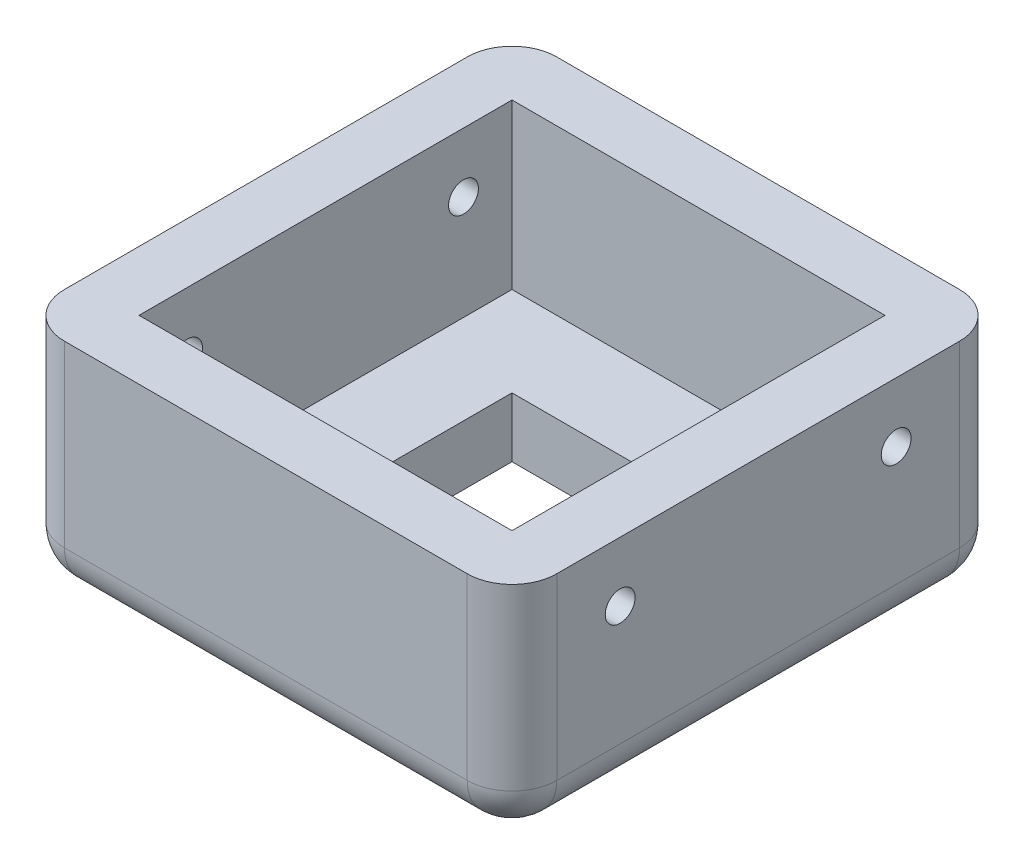
ISO-10303-21;
HEADER;
FILE_DESCRIPTION(('STEP AP214'),'2;1');
FILE_NAME('part.step','',(''),(''),'','','');
FILE_SCHEMA(('AUTOMOTIVE_DESIGN { 1 0 10303 214 1 1 1 1 }'));
ENDSEC;
DATA;
#1=APPLICATION_CONTEXT('core data for automotive mechanical design processes');
#2=APPLICATION_PROTOCOL_DEFINITION('international standard','automotive_design',2000,#1);
#3=PRODUCT_CONTEXT('',#1,'mechanical');
#4=PRODUCT('Part','Part','',(#3));
#5=PRODUCT_RELATED_PRODUCT_CATEGORY('part','',(#4));
#6=PRODUCT_DEFINITION_FORMATION('','',#4);
#7=PRODUCT_DEFINITION_CONTEXT('part definition',#1,'design');
#8=PRODUCT_DEFINITION('design','',#6,#7);
#9=PRODUCT_DEFINITION_SHAPE('','',#8);
#10=(LENGTH_UNIT() NAMED_UNIT(*) SI_UNIT(.MILLI.,.METRE.));
#11=(NAMED_UNIT(*) PLANE_ANGLE_UNIT() SI_UNIT($,.RADIAN.));
#12=(NAMED_UNIT(*) SI_UNIT($,.STERADIAN.) SOLID_ANGLE_UNIT());
#13=UNCERTAINTY_MEASURE_WITH_UNIT(LENGTH_MEASURE(1.E-05),#10,'distance_accuracy_value','');
#14=(GEOMETRIC_REPRESENTATION_CONTEXT(3) GLOBAL_UNCERTAINTY_ASSIGNED_CONTEXT((#13)) GLOBAL_UNIT_ASSIGNED_CONTEXT((#10,
#11,#12)) REPRESENTATION_CONTEXT('',''));
#15=CARTESIAN_POINT('',(0.,0.,0.));
#16=DIRECTION('',(0.,0.,1.));
#17=DIRECTION('',(1.,0.,0.));
#18=AXIS2_PLACEMENT_3D('',#15,#16,#17);
#19=CARTESIAN_POINT('',(0.,15.,0.));
#20=DIRECTION('',(1.,0.,0.));
#21=DIRECTION('',(0.,0.,-1.));
#22=AXIS2_PLACEMENT_3D('',#19,#20,#21);
#23=PLANE('',#22);
#24=DIRECTION('',(0.,-1.,0.));
#25=VECTOR('',#24,1.);
#26=CARTESIAN_POINT('',(0.,15.,-13.));
#27=LINE('',#26,#25);
#28=CARTESIAN_POINT('',(0.,4.,-13.));
#29=VERTEX_POINT('',#28);
#30=CARTESIAN_POINT('',(0.,0.,-13.));
#31=VERTEX_POINT('',#30);
#32=EDGE_CURVE('E229',#29,#31,#27,.T.);
#33=ORIENTED_EDGE('',*,*,#32,.F.);
#34=DIRECTION('',(0.,0.,1.));
#35=VECTOR('',#34,1.);
#36=CARTESIAN_POINT('',(0.,4.,0.));
#37=LINE('',#36,#35);
#38=CARTESIAN_POINT('',(0.,4.,0.));
#39=VERTEX_POINT('',#38);
#40=EDGE_CURVE('E214',#29,#39,#37,.T.);
#41=ORIENTED_EDGE('',*,*,#40,.T.);
#42=DIRECTION('',(0.,-1.,0.));
#43=VECTOR('',#42,1.);
#44=CARTESIAN_POINT('',(0.,15.,0.));
#45=LINE('',#44,#43);
#46=CARTESIAN_POINT('',(0.,0.,0.));
#47=VERTEX_POINT('',#46);
#48=EDGE_CURVE('E235',#39,#47,#45,.T.);
#49=ORIENTED_EDGE('',*,*,#48,.T.);
#50=DIRECTION('',(0.,0.,1.));
#51=VECTOR('',#50,1.);
#52=CARTESIAN_POINT('',(0.,0.,0.));
#53=LINE('',#52,#51);
#54=EDGE_CURVE('E217',#31,#47,#53,.T.);
#55=ORIENTED_EDGE('',*,*,#54,.F.);
#56=EDGE_LOOP('',(#33,#41,#49,#55));
#57=FACE_BOUND('',#56,.T.);
#58=ADVANCED_FACE('F37',(#57),#23,.T.);
#59=CARTESIAN_POINT('',(0.,15.,0.));
#60=DIRECTION('',(0.,0.,-1.));
#61=DIRECTION('',(-1.,0.,0.));
#62=AXIS2_PLACEMENT_3D('',#59,#60,#61);
#63=PLANE('',#62);
#64=ORIENTED_EDGE('',*,*,#48,.F.);
#65=DIRECTION('',(1.,0.,0.));
#66=VECTOR('',#65,1.);
#67=CARTESIAN_POINT('',(0.,4.,0.));
#68=LINE('',#67,#66);
#69=CARTESIAN_POINT('',(13.,4.,0.));
#70=VERTEX_POINT('',#69);
#71=EDGE_CURVE('E211',#39,#70,#68,.T.);
#72=ORIENTED_EDGE('',*,*,#71,.T.);
#73=DIRECTION('',(0.,-1.,0.));
#74=VECTOR('',#73,1.);
#75=CARTESIAN_POINT('',(13.,15.,0.));
#76=LINE('',#75,#74);
#77=CARTESIAN_POINT('',(13.,0.,0.));
#78=VERTEX_POINT('',#77);
#79=EDGE_CURVE('E233',#70,#78,#76,.T.);
#80=ORIENTED_EDGE('',*,*,#79,.T.);
#81=DIRECTION('',(1.,0.,0.));
#82=VECTOR('',#81,1.);
#83=CARTESIAN_POINT('',(0.,0.,0.));
#84=LINE('',#83,#82);
#85=EDGE_CURVE('E220',#47,#78,#84,.T.);
#86=ORIENTED_EDGE('',*,*,#85,.F.);
#87=EDGE_LOOP('',(#64,#72,#80,#86));
#88=FACE_BOUND('',#87,.T.);
#89=ADVANCED_FACE('F365',(#88),#63,.T.);
#90=CARTESIAN_POINT('',(13.,15.,0.));
#91=DIRECTION('',(-1.,0.,0.));
#92=DIRECTION('',(0.,0.,1.));
#93=AXIS2_PLACEMENT_3D('',#90,#91,#92);
#94=PLANE('',#93);
#95=ORIENTED_EDGE('',*,*,#79,.F.);
#96=DIRECTION('',(0.,0.,-1.));
#97=VECTOR('',#96,1.);
#98=CARTESIAN_POINT('',(13.,4.,0.));
#99=LINE('',#98,#97);
#100=CARTESIAN_POINT('',(13.,4.,-13.));
#101=VERTEX_POINT('',#100);
#102=EDGE_CURVE('E205',#70,#101,#99,.T.);
#103=ORIENTED_EDGE('',*,*,#102,.T.);
#104=DIRECTION('',(0.,-1.,0.));
#105=VECTOR('',#104,1.);
#106=CARTESIAN_POINT('',(13.,15.,-13.));
#107=LINE('',#106,#105);
#108=CARTESIAN_POINT('',(13.,0.,-13.));
#109=VERTEX_POINT('',#108);
#110=EDGE_CURVE('E231',#101,#109,#107,.T.);
#111=ORIENTED_EDGE('',*,*,#110,.T.);
#112=DIRECTION('',(0.,0.,-1.));
#113=VECTOR('',#112,1.);
#114=CARTESIAN_POINT('',(13.,0.,0.));
#115=LINE('',#114,#113);
#116=EDGE_CURVE('E223',#78,#109,#115,.T.);
#117=ORIENTED_EDGE('',*,*,#116,.F.);
#118=EDGE_LOOP('',(#95,#103,#111,#117));
#119=FACE_BOUND('',#118,.T.);
#120=ADVANCED_FACE('F371',(#119),#94,.T.);
#121=CARTESIAN_POINT('',(0.,15.,-13.));
#122=DIRECTION('',(0.,0.,1.));
#123=DIRECTION('',(1.,0.,0.));
#124=AXIS2_PLACEMENT_3D('',#121,#122,#123);
#125=PLANE('',#124);
#126=ORIENTED_EDGE('',*,*,#110,.F.);
#127=DIRECTION('',(-1.,0.,0.));
#128=VECTOR('',#127,1.);
#129=CARTESIAN_POINT('',(0.,4.,-13.));
#130=LINE('',#129,#128);
#131=EDGE_CURVE('E249',#101,#29,#130,.T.);
#132=ORIENTED_EDGE('',*,*,#131,.T.);
#133=ORIENTED_EDGE('',*,*,#32,.T.);
#134=DIRECTION('',(-1.,0.,0.));
#135=VECTOR('',#134,1.);
#136=CARTESIAN_POINT('',(0.,0.,-13.));
#137=LINE('',#136,#135);
#138=EDGE_CURVE('E226',#109,#31,#137,.T.);
#139=ORIENTED_EDGE('',*,*,#138,.F.);
#140=EDGE_LOOP('',(#126,#132,#133,#139));
#141=FACE_BOUND('',#140,.T.);
#142=ADVANCED_FACE('F381',(#141),#125,.T.);
#143=CARTESIAN_POINT('',(0.,15.,0.));
#144=DIRECTION('',(0.,1.,0.));
#145=DIRECTION('',(0.,0.,1.));
#146=AXIS2_PLACEMENT_3D('',#143,#144,#145);
#147=PLANE('',#146);
#148=DIRECTION('',(0.,0.,1.));
#149=VECTOR('',#148,1.);
#150=CARTESIAN_POINT('',(-6.00000000000001,15.,-19.));
#151=LINE('',#150,#149);
#152=CARTESIAN_POINT('',(-6.00000000000001,15.,-19.));
#153=VERTEX_POINT('',#152);
#154=CARTESIAN_POINT('',(-6.,15.,6.00000000000001));
#155=VERTEX_POINT('',#154);
#156=EDGE_CURVE('E169',#153,#155,#151,.T.);
#157=ORIENTED_EDGE('',*,*,#156,.F.);
#158=DIRECTION('',(-1.,0.,0.));
#159=VECTOR('',#158,1.);
#160=CARTESIAN_POINT('',(-6.00000000000001,15.,-19.));
#161=LINE('',#160,#159);
#162=CARTESIAN_POINT('',(19.,15.,-19.));
#163=VERTEX_POINT('',#162);
#164=EDGE_CURVE('E186',#163,#153,#161,.T.);
#165=ORIENTED_EDGE('',*,*,#164,.F.);
#166=DIRECTION('',(0.,0.,-1.));
#167=VECTOR('',#166,1.);
#168=CARTESIAN_POINT('',(19.,15.,-19.));
#169=LINE('',#168,#167);
#170=CARTESIAN_POINT('',(19.,15.,6.));
#171=VERTEX_POINT('',#170);
#172=EDGE_CURVE('E189',#171,#163,#169,.T.);
#173=ORIENTED_EDGE('',*,*,#172,.F.);
#174=DIRECTION('',(1.,0.,0.));
#175=VECTOR('',#174,1.);
#176=CARTESIAN_POINT('',(-6.,15.,6.00000000000001));
#177=LINE('',#176,#175);
#178=EDGE_CURVE('E198',#155,#171,#177,.T.);
#179=ORIENTED_EDGE('',*,*,#178,.F.);
#180=EDGE_LOOP('',(#157,#165,#173,#179));
#181=FACE_BOUND('',#180,.T.);
#182=DIRECTION('',(-1.,0.,0.));
#183=VECTOR('',#182,1.);
#184=CARTESIAN_POINT('',(-10.,15.,-23.));
#185=LINE('',#184,#183);
#186=CARTESIAN_POINT('',(20.,15.,-23.));
#187=VERTEX_POINT('',#186);
#188=CARTESIAN_POINT('',(-7.00000000000001,15.,-23.));
#189=VERTEX_POINT('',#188);
#190=EDGE_CURVE('E246',#187,#189,#185,.T.);
#191=ORIENTED_EDGE('',*,*,#190,.T.);
#192=CARTESIAN_POINT('',(-7.,15.,-20.));
#193=DIRECTION('',(0.,1.,0.));
#194=DIRECTION('',(0.,0.,1.));
#195=AXIS2_PLACEMENT_3D('',#192,#193,#194);
#196=CIRCLE('',#195,3.);
#197=CARTESIAN_POINT('',(-10.,15.,-20.));
#198=VERTEX_POINT('',#197);
#199=EDGE_CURVE('E271',#189,#198,#196,.T.);
#200=ORIENTED_EDGE('',*,*,#199,.T.);
#201=DIRECTION('',(0.,0.,1.));
#202=VECTOR('',#201,1.);
#203=CARTESIAN_POINT('',(-10.,15.,-23.));
#204=LINE('',#203,#202);
#205=CARTESIAN_POINT('',(-9.99999999999998,15.,7.00000000000003));
#206=VERTEX_POINT('',#205);
#207=EDGE_CURVE('E237',#198,#206,#204,.T.);
#208=ORIENTED_EDGE('',*,*,#207,.T.);
#209=CARTESIAN_POINT('',(-6.99999999999998,15.,7.00000000000002));
#210=DIRECTION('',(0.,1.,0.));
#211=DIRECTION('',(0.,0.,1.));
#212=AXIS2_PLACEMENT_3D('',#209,#210,#211);
#213=CIRCLE('',#212,3.);
#214=CARTESIAN_POINT('',(-6.99999999999998,15.,10.));
#215=VERTEX_POINT('',#214);
#216=EDGE_CURVE('E269',#206,#215,#213,.T.);
#217=ORIENTED_EDGE('',*,*,#216,.T.);
#218=DIRECTION('',(1.,0.,0.));
#219=VECTOR('',#218,1.);
#220=CARTESIAN_POINT('',(-9.99999999999998,15.,10.));
#221=LINE('',#220,#219);
#222=CARTESIAN_POINT('',(20.,15.,10.));
#223=VERTEX_POINT('',#222);
#224=EDGE_CURVE('E240',#215,#223,#221,.T.);
#225=ORIENTED_EDGE('',*,*,#224,.T.);
#226=CARTESIAN_POINT('',(20.,15.,7.));
#227=DIRECTION('',(0.,1.,0.));
#228=DIRECTION('',(0.,0.,1.));
#229=AXIS2_PLACEMENT_3D('',#226,#227,#228);
#230=CIRCLE('',#229,3.);
#231=CARTESIAN_POINT('',(23.,15.,7.));
#232=VERTEX_POINT('',#231);
#233=EDGE_CURVE('E265',#223,#232,#230,.T.);
#234=ORIENTED_EDGE('',*,*,#233,.T.);
#235=DIRECTION('',(0.,0.,-1.));
#236=VECTOR('',#235,1.);
#237=CARTESIAN_POINT('',(23.,15.,-23.));
#238=LINE('',#237,#236);
#239=CARTESIAN_POINT('',(23.,15.,-20.));
#240=VERTEX_POINT('',#239);
#241=EDGE_CURVE('E243',#232,#240,#238,.T.);
#242=ORIENTED_EDGE('',*,*,#241,.T.);
#243=CARTESIAN_POINT('',(20.,15.,-20.));
#244=DIRECTION('',(0.,1.,0.));
#245=DIRECTION('',(0.,0.,1.));
#246=AXIS2_PLACEMENT_3D('',#243,#244,#245);
#247=CIRCLE('',#246,3.);
#248=EDGE_CURVE('E267',#240,#187,#247,.T.);
#249=ORIENTED_EDGE('',*,*,#248,.T.);
#250=EDGE_LOOP('',(#191,#200,#208,#217,#225,#234,#242,#249));
#251=FACE_BOUND('',#250,.T.);
#252=ADVANCED_FACE('F377',(#181,#251),#147,.T.);
#253=CARTESIAN_POINT('',(0.,0.,0.));
#254=DIRECTION('',(0.,1.,0.));
#255=DIRECTION('',(0.,0.,1.));
#256=AXIS2_PLACEMENT_3D('',#253,#254,#255);
#257=PLANE('',#256);
#258=DIRECTION('',(1.,0.,0.));
#259=VECTOR('',#258,1.);
#260=CARTESIAN_POINT('',(0.,0.,7.00000000000002));
#261=LINE('',#260,#259);
#262=CARTESIAN_POINT('',(20.,0.,7.));
#263=VERTEX_POINT('',#262);
#264=CARTESIAN_POINT('',(-6.99999999999998,0.,7.00000000000002));
#265=VERTEX_POINT('',#264);
#266=EDGE_CURVE('E279',#263,#265,#261,.F.);
#267=ORIENTED_EDGE('',*,*,#266,.T.);
#268=DIRECTION('',(0.,0.,1.));
#269=VECTOR('',#268,1.);
#270=CARTESIAN_POINT('',(-6.99999999999999,0.,0.));
#271=LINE('',#270,#269);
#272=CARTESIAN_POINT('',(-7.,0.,-20.));
#273=VERTEX_POINT('',#272);
#274=EDGE_CURVE('E285',#265,#273,#271,.F.);
#275=ORIENTED_EDGE('',*,*,#274,.T.);
#276=DIRECTION('',(-1.,0.,0.));
#277=VECTOR('',#276,1.);
#278=CARTESIAN_POINT('',(0.,0.,-20.));
#279=LINE('',#278,#277);
#280=CARTESIAN_POINT('',(20.,0.,-20.));
#281=VERTEX_POINT('',#280);
#282=EDGE_CURVE('E283',#273,#281,#279,.F.);
#283=ORIENTED_EDGE('',*,*,#282,.T.);
#284=DIRECTION('',(0.,0.,-1.));
#285=VECTOR('',#284,1.);
#286=CARTESIAN_POINT('',(20.,0.,0.));
#287=LINE('',#286,#285);
#288=EDGE_CURVE('E281',#281,#263,#287,.F.);
#289=ORIENTED_EDGE('',*,*,#288,.T.);
#290=EDGE_LOOP('',(#267,#275,#283,#289));
#291=FACE_BOUND('',#290,.T.);
#292=ORIENTED_EDGE('',*,*,#54,.T.);
#293=ORIENTED_EDGE('',*,*,#85,.T.);
#294=ORIENTED_EDGE('',*,*,#116,.T.);
#295=ORIENTED_EDGE('',*,*,#138,.T.);
#296=EDGE_LOOP('',(#292,#293,#294,#295));
#297=FACE_BOUND('',#296,.T.);
#298=ADVANCED_FACE('F380',(#291,#297),#257,.F.);
#299=CARTESIAN_POINT('',(-10.,15.,-23.));
#300=DIRECTION('',(1.,0.,0.));
#301=DIRECTION('',(0.,0.,-1.));
#302=AXIS2_PLACEMENT_3D('',#299,#300,#301);
#303=PLANE('',#302);
#304=CARTESIAN_POINT('',(-9.99999999999999,11.,-15.75));
#305=DIRECTION('',(-1.,0.,0.));
#306=DIRECTION('',(0.,0.,1.));
#307=AXIS2_PLACEMENT_3D('',#304,#305,#306);
#308=CIRCLE('',#307,1.);
#309=CARTESIAN_POINT('',(-9.99999999999999,11.,-14.75));
#310=VERTEX_POINT('',#309);
#311=EDGE_CURVE('E338',#310,#310,#308,.T.);
#312=ORIENTED_EDGE('',*,*,#311,.F.);
#313=EDGE_LOOP('',(#312));
#314=FACE_BOUND('',#313,.T.);
#315=CARTESIAN_POINT('',(-9.99999999999999,11.,2.75));
#316=DIRECTION('',(-1.,0.,0.));
#317=DIRECTION('',(0.,0.,1.));
#318=AXIS2_PLACEMENT_3D('',#315,#316,#317);
#319=CIRCLE('',#318,1.);
#320=CARTESIAN_POINT('',(-9.99999999999999,11.,3.75000000000001));
#321=VERTEX_POINT('',#320);
#322=EDGE_CURVE('E329',#321,#321,#319,.T.);
#323=ORIENTED_EDGE('',*,*,#322,.F.);
#324=EDGE_LOOP('',(#323));
#325=FACE_BOUND('',#324,.T.);
#326=ORIENTED_EDGE('',*,*,#207,.F.);
#327=DIRECTION('',(0.,-1.,0.));
#328=VECTOR('',#327,1.);
#329=CARTESIAN_POINT('',(-10.,15.,-20.));
#330=LINE('',#329,#328);
#331=CARTESIAN_POINT('',(-10.,3.,-20.));
#332=VERTEX_POINT('',#331);
#333=EDGE_CURVE('E256',#198,#332,#330,.T.);
#334=ORIENTED_EDGE('',*,*,#333,.T.);
#335=DIRECTION('',(0.,0.,1.));
#336=VECTOR('',#335,1.);
#337=CARTESIAN_POINT('',(-10.,3.,-23.));
#338=LINE('',#337,#336);
#339=CARTESIAN_POINT('',(-9.99999999999998,3.,7.00000000000003));
#340=VERTEX_POINT('',#339);
#341=EDGE_CURVE('E252',#332,#340,#338,.T.);
#342=ORIENTED_EDGE('',*,*,#341,.T.);
#343=DIRECTION('',(0.,-1.,0.));
#344=VECTOR('',#343,1.);
#345=CARTESIAN_POINT('',(-9.99999999999998,15.,7.00000000000003));
#346=LINE('',#345,#344);
#347=EDGE_CURVE('E254',#340,#206,#346,.F.);
#348=ORIENTED_EDGE('',*,*,#347,.T.);
#349=EDGE_LOOP('',(#326,#334,#342,#348));
#350=FACE_BOUND('',#349,.T.);
#351=ADVANCED_FACE('F385',(#314,#325,#350),#303,.F.);
#352=CARTESIAN_POINT('',(-9.99999999999998,15.,10.));
#353=DIRECTION('',(0.,0.,-1.));
#354=DIRECTION('',(-1.,0.,0.));
#355=AXIS2_PLACEMENT_3D('',#352,#353,#354);
#356=PLANE('',#355);
#357=ORIENTED_EDGE('',*,*,#224,.F.);
#358=DIRECTION('',(0.,-1.,0.));
#359=VECTOR('',#358,1.);
#360=CARTESIAN_POINT('',(-6.99999999999998,15.,10.));
#361=LINE('',#360,#359);
#362=CARTESIAN_POINT('',(-6.99999999999998,3.,10.));
#363=VERTEX_POINT('',#362);
#364=EDGE_CURVE('E277',#215,#363,#361,.T.);
#365=ORIENTED_EDGE('',*,*,#364,.T.);
#366=DIRECTION('',(1.,0.,0.));
#367=VECTOR('',#366,1.);
#368=CARTESIAN_POINT('',(-9.99999999999998,3.,10.));
#369=LINE('',#368,#367);
#370=CARTESIAN_POINT('',(20.,3.,10.));
#371=VERTEX_POINT('',#370);
#372=EDGE_CURVE('E273',#363,#371,#369,.T.);
#373=ORIENTED_EDGE('',*,*,#372,.T.);
#374=DIRECTION('',(0.,-1.,0.));
#375=VECTOR('',#374,1.);
#376=CARTESIAN_POINT('',(20.,15.,10.));
#377=LINE('',#376,#375);
#378=EDGE_CURVE('E275',#371,#223,#377,.F.);
#379=ORIENTED_EDGE('',*,*,#378,.T.);
#380=EDGE_LOOP('',(#357,#365,#373,#379));
#381=FACE_BOUND('',#380,.T.);
#382=ADVANCED_FACE('F394',(#381),#356,.F.);
#383=CARTESIAN_POINT('',(23.,15.,-23.));
#384=DIRECTION('',(-1.,0.,0.));
#385=DIRECTION('',(0.,0.,1.));
#386=AXIS2_PLACEMENT_3D('',#383,#384,#385);
#387=PLANE('',#386);
#388=CARTESIAN_POINT('',(23.,11.,-15.75));
#389=DIRECTION('',(-1.,0.,0.));
#390=DIRECTION('',(0.,0.,1.));
#391=AXIS2_PLACEMENT_3D('',#388,#389,#390);
#392=CIRCLE('',#391,1.);
#393=CARTESIAN_POINT('',(23.,11.,-14.75));
#394=VERTEX_POINT('',#393);
#395=EDGE_CURVE('E341',#394,#394,#392,.T.);
#396=ORIENTED_EDGE('',*,*,#395,.T.);
#397=EDGE_LOOP('',(#396));
#398=FACE_BOUND('',#397,.T.);
#399=CARTESIAN_POINT('',(23.,11.,2.75));
#400=DIRECTION('',(-1.,0.,0.));
#401=DIRECTION('',(0.,0.,1.));
#402=AXIS2_PLACEMENT_3D('',#399,#400,#401);
#403=CIRCLE('',#402,1.);
#404=CARTESIAN_POINT('',(23.,11.,3.75));
#405=VERTEX_POINT('',#404);
#406=EDGE_CURVE('E324',#405,#405,#403,.T.);
#407=ORIENTED_EDGE('',*,*,#406,.T.);
#408=EDGE_LOOP('',(#407));
#409=FACE_BOUND('',#408,.T.);
#410=DIRECTION('',(0.,0.,-1.));
#411=VECTOR('',#410,1.);
#412=CARTESIAN_POINT('',(23.,3.,-23.));
#413=LINE('',#412,#411);
#414=CARTESIAN_POINT('',(23.,3.,7.));
#415=VERTEX_POINT('',#414);
#416=CARTESIAN_POINT('',(23.,3.,-20.));
#417=VERTEX_POINT('',#416);
#418=EDGE_CURVE('E46',#415,#417,#413,.T.);
#419=ORIENTED_EDGE('',*,*,#418,.T.);
#420=DIRECTION('',(0.,-1.,0.));
#421=VECTOR('',#420,1.);
#422=CARTESIAN_POINT('',(23.,15.,-20.));
#423=LINE('',#422,#421);
#424=EDGE_CURVE('E11',#417,#240,#423,.F.);
#425=ORIENTED_EDGE('',*,*,#424,.T.);
#426=ORIENTED_EDGE('',*,*,#241,.F.);
#427=DIRECTION('',(0.,-1.,0.));
#428=VECTOR('',#427,1.);
#429=CARTESIAN_POINT('',(23.,15.,7.));
#430=LINE('',#429,#428);
#431=EDGE_CURVE('E57',#232,#415,#430,.T.);
#432=ORIENTED_EDGE('',*,*,#431,.T.);
#433=EDGE_LOOP('',(#419,#425,#426,#432));
#434=FACE_BOUND('',#433,.T.);
#435=ADVANCED_FACE('F390',(#398,#409,#434),#387,.F.);
#436=CARTESIAN_POINT('',(-10.,15.,-23.));
#437=DIRECTION('',(0.,0.,1.));
#438=DIRECTION('',(1.,0.,0.));
#439=AXIS2_PLACEMENT_3D('',#436,#437,#438);
#440=PLANE('',#439);
#441=DIRECTION('',(-1.,0.,0.));
#442=VECTOR('',#441,1.);
#443=CARTESIAN_POINT('',(-10.,3.,-23.));
#444=LINE('',#443,#442);
#445=CARTESIAN_POINT('',(20.,3.,-23.));
#446=VERTEX_POINT('',#445);
#447=CARTESIAN_POINT('',(-7.00000000000001,3.,-23.));
#448=VERTEX_POINT('',#447);
#449=EDGE_CURVE('E261',#446,#448,#444,.T.);
#450=ORIENTED_EDGE('',*,*,#449,.T.);
#451=DIRECTION('',(0.,-1.,0.));
#452=VECTOR('',#451,1.);
#453=CARTESIAN_POINT('',(-7.00000000000001,15.,-23.));
#454=LINE('',#453,#452);
#455=EDGE_CURVE('E263',#448,#189,#454,.F.);
#456=ORIENTED_EDGE('',*,*,#455,.T.);
#457=ORIENTED_EDGE('',*,*,#190,.F.);
#458=DIRECTION('',(0.,-1.,0.));
#459=VECTOR('',#458,1.);
#460=CARTESIAN_POINT('',(20.,15.,-23.));
#461=LINE('',#460,#459);
#462=EDGE_CURVE('E259',#187,#446,#461,.T.);
#463=ORIENTED_EDGE('',*,*,#462,.T.);
#464=EDGE_LOOP('',(#450,#456,#457,#463));
#465=FACE_BOUND('',#464,.T.);
#466=ADVANCED_FACE('F387',(#465),#440,.F.);
#467=CARTESIAN_POINT('',(-6.00000000000001,4.,-19.));
#468=DIRECTION('',(-1.,0.,0.));
#469=DIRECTION('',(0.,0.,1.));
#470=AXIS2_PLACEMENT_3D('',#467,#468,#469);
#471=PLANE('',#470);
#472=CARTESIAN_POINT('',(-6.00000000000001,11.,-15.75));
#473=DIRECTION('',(-1.,0.,0.));
#474=DIRECTION('',(0.,0.,1.));
#475=AXIS2_PLACEMENT_3D('',#472,#473,#474);
#476=CIRCLE('',#475,1.);
#477=CARTESIAN_POINT('',(-6.00000000000001,11.,-14.75));
#478=VERTEX_POINT('',#477);
#479=EDGE_CURVE('E334',#478,#478,#476,.T.);
#480=ORIENTED_EDGE('',*,*,#479,.T.);
#481=EDGE_LOOP('',(#480));
#482=FACE_BOUND('',#481,.T.);
#483=CARTESIAN_POINT('',(-6.,11.,2.75));
#484=DIRECTION('',(-1.,0.,0.));
#485=DIRECTION('',(0.,0.,1.));
#486=AXIS2_PLACEMENT_3D('',#483,#484,#485);
#487=CIRCLE('',#486,1.);
#488=CARTESIAN_POINT('',(-6.,11.,3.75));
#489=VERTEX_POINT('',#488);
#490=EDGE_CURVE('E192',#489,#489,#487,.T.);
#491=ORIENTED_EDGE('',*,*,#490,.T.);
#492=EDGE_LOOP('',(#491));
#493=FACE_BOUND('',#492,.T.);
#494=ORIENTED_EDGE('',*,*,#156,.T.);
#495=DIRECTION('',(0.,1.,0.));
#496=VECTOR('',#495,1.);
#497=CARTESIAN_POINT('',(-6.,4.,6.00000000000001));
#498=LINE('',#497,#496);
#499=CARTESIAN_POINT('',(-6.,4.,6.00000000000001));
#500=VERTEX_POINT('',#499);
#501=EDGE_CURVE('E162',#500,#155,#498,.T.);
#502=ORIENTED_EDGE('',*,*,#501,.F.);
#503=DIRECTION('',(0.,0.,1.));
#504=VECTOR('',#503,1.);
#505=CARTESIAN_POINT('',(-6.00000000000001,4.,-19.));
#506=LINE('',#505,#504);
#507=CARTESIAN_POINT('',(-6.00000000000001,4.,-19.));
#508=VERTEX_POINT('',#507);
#509=EDGE_CURVE('E166',#508,#500,#506,.T.);
#510=ORIENTED_EDGE('',*,*,#509,.F.);
#511=DIRECTION('',(0.,1.,0.));
#512=VECTOR('',#511,1.);
#513=CARTESIAN_POINT('',(-6.00000000000001,4.,-19.));
#514=LINE('',#513,#512);
#515=EDGE_CURVE('E203',#508,#153,#514,.T.);
#516=ORIENTED_EDGE('',*,*,#515,.T.);
#517=EDGE_LOOP('',(#494,#502,#510,#516));
#518=FACE_BOUND('',#517,.T.);
#519=ADVANCED_FACE('F164',(#482,#493,#518),#471,.F.);
#520=CARTESIAN_POINT('',(-6.00000000000001,4.,-19.));
#521=DIRECTION('',(0.,0.,-1.));
#522=DIRECTION('',(-1.,0.,0.));
#523=AXIS2_PLACEMENT_3D('',#520,#521,#522);
#524=PLANE('',#523);
#525=ORIENTED_EDGE('',*,*,#164,.T.);
#526=ORIENTED_EDGE('',*,*,#515,.F.);
#527=DIRECTION('',(-1.,0.,0.));
#528=VECTOR('',#527,1.);
#529=CARTESIAN_POINT('',(-6.00000000000001,4.,-19.));
#530=LINE('',#529,#528);
#531=CARTESIAN_POINT('',(19.,4.,-19.));
#532=VERTEX_POINT('',#531);
#533=EDGE_CURVE('E174',#532,#508,#530,.T.);
#534=ORIENTED_EDGE('',*,*,#533,.F.);
#535=DIRECTION('',(0.,1.,0.));
#536=VECTOR('',#535,1.);
#537=CARTESIAN_POINT('',(19.,4.,-19.));
#538=LINE('',#537,#536);
#539=EDGE_CURVE('E206',#532,#163,#538,.T.);
#540=ORIENTED_EDGE('',*,*,#539,.T.);
#541=EDGE_LOOP('',(#525,#526,#534,#540));
#542=FACE_BOUND('',#541,.T.);
#543=ADVANCED_FACE('F498',(#542),#524,.F.);
#544=CARTESIAN_POINT('',(19.,4.,-19.));
#545=DIRECTION('',(1.,0.,0.));
#546=DIRECTION('',(0.,0.,-1.));
#547=AXIS2_PLACEMENT_3D('',#544,#545,#546);
#548=PLANE('',#547);
#549=CARTESIAN_POINT('',(19.,11.,-15.75));
#550=DIRECTION('',(1.,0.,0.));
#551=DIRECTION('',(0.,0.,-1.));
#552=AXIS2_PLACEMENT_3D('',#549,#550,#551);
#553=CIRCLE('',#552,1.);
#554=CARTESIAN_POINT('',(19.,11.,-16.75));
#555=VERTEX_POINT('',#554);
#556=EDGE_CURVE('E41',#555,#555,#553,.T.);
#557=ORIENTED_EDGE('',*,*,#556,.T.);
#558=EDGE_LOOP('',(#557));
#559=FACE_BOUND('',#558,.T.);
#560=CARTESIAN_POINT('',(19.,11.,2.75));
#561=DIRECTION('',(1.,0.,0.));
#562=DIRECTION('',(0.,0.,-1.));
#563=AXIS2_PLACEMENT_3D('',#560,#561,#562);
#564=CIRCLE('',#563,1.);
#565=CARTESIAN_POINT('',(19.,11.,1.75));
#566=VERTEX_POINT('',#565);
#567=EDGE_CURVE('E322',#566,#566,#564,.T.);
#568=ORIENTED_EDGE('',*,*,#567,.T.);
#569=EDGE_LOOP('',(#568));
#570=FACE_BOUND('',#569,.T.);
#571=ORIENTED_EDGE('',*,*,#172,.T.);
#572=ORIENTED_EDGE('',*,*,#539,.F.);
#573=DIRECTION('',(0.,0.,-1.));
#574=VECTOR('',#573,1.);
#575=CARTESIAN_POINT('',(19.,4.,-19.));
#576=LINE('',#575,#574);
#577=CARTESIAN_POINT('',(19.,4.,6.));
#578=VERTEX_POINT('',#577);
#579=EDGE_CURVE('E182',#578,#532,#576,.T.);
#580=ORIENTED_EDGE('',*,*,#579,.F.);
#581=DIRECTION('',(0.,1.,0.));
#582=VECTOR('',#581,1.);
#583=CARTESIAN_POINT('',(19.,4.,6.));
#584=LINE('',#583,#582);
#585=EDGE_CURVE('E173',#578,#171,#584,.T.);
#586=ORIENTED_EDGE('',*,*,#585,.T.);
#587=EDGE_LOOP('',(#571,#572,#580,#586));
#588=FACE_BOUND('',#587,.T.);
#589=ADVANCED_FACE('F348',(#559,#570,#588),#548,.F.);
#590=CARTESIAN_POINT('',(-6.,4.,6.00000000000001));
#591=DIRECTION('',(0.,0.,1.));
#592=DIRECTION('',(1.,0.,0.));
#593=AXIS2_PLACEMENT_3D('',#590,#591,#592);
#594=PLANE('',#593);
#595=ORIENTED_EDGE('',*,*,#178,.T.);
#596=ORIENTED_EDGE('',*,*,#585,.F.);
#597=DIRECTION('',(1.,0.,0.));
#598=VECTOR('',#597,1.);
#599=CARTESIAN_POINT('',(-6.,4.,6.00000000000001));
#600=LINE('',#599,#598);
#601=EDGE_CURVE('E177',#500,#578,#600,.T.);
#602=ORIENTED_EDGE('',*,*,#601,.F.);
#603=ORIENTED_EDGE('',*,*,#501,.T.);
#604=EDGE_LOOP('',(#595,#596,#602,#603));
#605=FACE_BOUND('',#604,.T.);
#606=ADVANCED_FACE('F178',(#605),#594,.F.);
#607=CARTESIAN_POINT('',(0.,4.,0.));
#608=DIRECTION('',(0.,1.,0.));
#609=DIRECTION('',(0.,0.,1.));
#610=AXIS2_PLACEMENT_3D('',#607,#608,#609);
#611=PLANE('',#610);
#612=ORIENTED_EDGE('',*,*,#131,.F.);
#613=ORIENTED_EDGE('',*,*,#102,.F.);
#614=ORIENTED_EDGE('',*,*,#71,.F.);
#615=ORIENTED_EDGE('',*,*,#40,.F.);
#616=EDGE_LOOP('',(#612,#613,#614,#615));
#617=FACE_BOUND('',#616,.T.);
#618=ORIENTED_EDGE('',*,*,#509,.T.);
#619=ORIENTED_EDGE('',*,*,#601,.T.);
#620=ORIENTED_EDGE('',*,*,#579,.T.);
#621=ORIENTED_EDGE('',*,*,#533,.T.);
#622=EDGE_LOOP('',(#618,#619,#620,#621));
#623=FACE_BOUND('',#622,.T.);
#624=ADVANCED_FACE('F184',(#617,#623),#611,.T.);
#625=CARTESIAN_POINT('',(20.,15.,7.));
#626=DIRECTION('',(0.,-1.,0.));
#627=DIRECTION('',(0.,0.,-1.));
#628=AXIS2_PLACEMENT_3D('',#625,#626,#627);
#629=CYLINDRICAL_SURFACE('',#628,3.);
#630=CARTESIAN_POINT('',(20.,3.,7.));
#631=DIRECTION('',(0.,-1.,0.));
#632=DIRECTION('',(0.,0.,-1.));
#633=AXIS2_PLACEMENT_3D('',#630,#631,#632);
#634=CIRCLE('',#633,3.);
#635=EDGE_CURVE('E199',#415,#371,#634,.T.);
#636=ORIENTED_EDGE('',*,*,#635,.F.);
#637=ORIENTED_EDGE('',*,*,#431,.F.);
#638=ORIENTED_EDGE('',*,*,#233,.F.);
#639=ORIENTED_EDGE('',*,*,#378,.F.);
#640=EDGE_LOOP('',(#636,#637,#638,#639));
#641=FACE_BOUND('',#640,.T.);
#642=ADVANCED_FACE('F39',(#641),#629,.T.);
#643=CARTESIAN_POINT('',(20.,3.,7.));
#644=DIRECTION('',(0.,0.,1.));
#645=DIRECTION('',(1.,0.,0.));
#646=AXIS2_PLACEMENT_3D('',#643,#644,#645);
#647=SPHERICAL_SURFACE('',#646,3.);
#648=CARTESIAN_POINT('',(20.,3.,7.));
#649=DIRECTION('',(0.,0.,1.));
#650=DIRECTION('',(1.,0.,0.));
#651=AXIS2_PLACEMENT_3D('',#648,#649,#650);
#652=CIRCLE('',#651,3.);
#653=EDGE_CURVE('E315',#415,#263,#652,.F.);
#654=ORIENTED_EDGE('',*,*,#653,.F.);
#655=ORIENTED_EDGE('',*,*,#635,.T.);
#656=CARTESIAN_POINT('',(20.,3.,7.));
#657=DIRECTION('',(1.,0.,0.));
#658=DIRECTION('',(0.,0.,-1.));
#659=AXIS2_PLACEMENT_3D('',#656,#657,#658);
#660=CIRCLE('',#659,3.);
#661=EDGE_CURVE('E318',#263,#371,#660,.F.);
#662=ORIENTED_EDGE('',*,*,#661,.F.);
#663=EDGE_LOOP('',(#654,#655,#662));
#664=FACE_BOUND('',#663,.T.);
#665=ADVANCED_FACE('F439',(#664),#647,.T.);
#666=CARTESIAN_POINT('',(-6.99999999999998,15.,7.00000000000002));
#667=DIRECTION('',(0.,-1.,0.));
#668=DIRECTION('',(0.,0.,-1.));
#669=AXIS2_PLACEMENT_3D('',#666,#667,#668);
#670=CYLINDRICAL_SURFACE('',#669,3.);
#671=ORIENTED_EDGE('',*,*,#216,.F.);
#672=ORIENTED_EDGE('',*,*,#347,.F.);
#673=CARTESIAN_POINT('',(-6.99999999999998,3.,7.00000000000002));
#674=DIRECTION('',(0.,-1.,0.));
#675=DIRECTION('',(0.,0.,-1.));
#676=AXIS2_PLACEMENT_3D('',#673,#674,#675);
#677=CIRCLE('',#676,3.);
#678=EDGE_CURVE('E312',#363,#340,#677,.T.);
#679=ORIENTED_EDGE('',*,*,#678,.F.);
#680=ORIENTED_EDGE('',*,*,#364,.F.);
#681=EDGE_LOOP('',(#671,#672,#679,#680));
#682=FACE_BOUND('',#681,.T.);
#683=ADVANCED_FACE('F436',(#682),#670,.T.);
#684=CARTESIAN_POINT('',(-9.99999999999998,3.,7.00000000000003));
#685=DIRECTION('',(1.,0.,0.));
#686=DIRECTION('',(0.,0.,-1.));
#687=AXIS2_PLACEMENT_3D('',#684,#685,#686);
#688=CYLINDRICAL_SURFACE('',#687,3.);
#689=ORIENTED_EDGE('',*,*,#661,.T.);
#690=ORIENTED_EDGE('',*,*,#372,.F.);
#691=CARTESIAN_POINT('',(-6.99999999999998,3.,7.00000000000002));
#692=DIRECTION('',(-1.,0.,0.));
#693=DIRECTION('',(0.,0.,1.));
#694=AXIS2_PLACEMENT_3D('',#691,#692,#693);
#695=CIRCLE('',#694,3.);
#696=EDGE_CURVE('E309',#265,#363,#695,.T.);
#697=ORIENTED_EDGE('',*,*,#696,.F.);
#698=ORIENTED_EDGE('',*,*,#266,.F.);
#699=EDGE_LOOP('',(#689,#690,#697,#698));
#700=FACE_BOUND('',#699,.T.);
#701=ADVANCED_FACE('F432',(#700),#688,.T.);
#702=CARTESIAN_POINT('',(20.,3.,-23.));
#703=DIRECTION('',(0.,0.,-1.));
#704=DIRECTION('',(-1.,0.,0.));
#705=AXIS2_PLACEMENT_3D('',#702,#703,#704);
#706=CYLINDRICAL_SURFACE('',#705,3.);
#707=ORIENTED_EDGE('',*,*,#653,.T.);
#708=ORIENTED_EDGE('',*,*,#288,.F.);
#709=CARTESIAN_POINT('',(20.,3.,-20.));
#710=DIRECTION('',(0.,0.,-1.));
#711=DIRECTION('',(-1.,0.,0.));
#712=AXIS2_PLACEMENT_3D('',#709,#710,#711);
#713=CIRCLE('',#712,3.);
#714=EDGE_CURVE('E306',#417,#281,#713,.T.);
#715=ORIENTED_EDGE('',*,*,#714,.F.);
#716=ORIENTED_EDGE('',*,*,#418,.F.);
#717=EDGE_LOOP('',(#707,#708,#715,#716));
#718=FACE_BOUND('',#717,.T.);
#719=ADVANCED_FACE('F428',(#718),#706,.T.);
#720=CARTESIAN_POINT('',(20.,15.,-20.));
#721=DIRECTION('',(0.,-1.,0.));
#722=DIRECTION('',(0.,0.,-1.));
#723=AXIS2_PLACEMENT_3D('',#720,#721,#722);
#724=CYLINDRICAL_SURFACE('',#723,3.);
#725=ORIENTED_EDGE('',*,*,#248,.F.);
#726=ORIENTED_EDGE('',*,*,#424,.F.);
#727=CARTESIAN_POINT('',(20.,3.,-20.));
#728=DIRECTION('',(0.,-1.,0.));
#729=DIRECTION('',(0.,0.,-1.));
#730=AXIS2_PLACEMENT_3D('',#727,#728,#729);
#731=CIRCLE('',#730,3.);
#732=EDGE_CURVE('E303',#446,#417,#731,.T.);
#733=ORIENTED_EDGE('',*,*,#732,.F.);
#734=ORIENTED_EDGE('',*,*,#462,.F.);
#735=EDGE_LOOP('',(#725,#726,#733,#734));
#736=FACE_BOUND('',#735,.T.);
#737=ADVANCED_FACE('F424',(#736),#724,.T.);
#738=CARTESIAN_POINT('',(-6.99999999999998,3.,7.00000000000002));
#739=DIRECTION('',(0.,0.,1.));
#740=DIRECTION('',(1.,0.,0.));
#741=AXIS2_PLACEMENT_3D('',#738,#739,#740);
#742=SPHERICAL_SURFACE('',#741,3.);
#743=ORIENTED_EDGE('',*,*,#696,.T.);
#744=ORIENTED_EDGE('',*,*,#678,.T.);
#745=CARTESIAN_POINT('',(-6.99999999999998,3.,7.00000000000002));
#746=DIRECTION('',(0.,0.,1.));
#747=DIRECTION('',(1.,0.,0.));
#748=AXIS2_PLACEMENT_3D('',#745,#746,#747);
#749=CIRCLE('',#748,3.);
#750=EDGE_CURVE('E300',#265,#340,#749,.F.);
#751=ORIENTED_EDGE('',*,*,#750,.F.);
#752=EDGE_LOOP('',(#743,#744,#751));
#753=FACE_BOUND('',#752,.T.);
#754=ADVANCED_FACE('F420',(#753),#742,.T.);
#755=CARTESIAN_POINT('',(20.,3.,-20.));
#756=DIRECTION('',(0.,0.,1.));
#757=DIRECTION('',(1.,0.,0.));
#758=AXIS2_PLACEMENT_3D('',#755,#756,#757);
#759=SPHERICAL_SURFACE('',#758,3.);
#760=ORIENTED_EDGE('',*,*,#732,.T.);
#761=ORIENTED_EDGE('',*,*,#714,.T.);
#762=CARTESIAN_POINT('',(20.,3.,-20.));
#763=DIRECTION('',(1.,0.,0.));
#764=DIRECTION('',(0.,0.,-1.));
#765=AXIS2_PLACEMENT_3D('',#762,#763,#764);
#766=CIRCLE('',#765,3.);
#767=EDGE_CURVE('E297',#446,#281,#766,.F.);
#768=ORIENTED_EDGE('',*,*,#767,.F.);
#769=EDGE_LOOP('',(#760,#761,#768));
#770=FACE_BOUND('',#769,.T.);
#771=ADVANCED_FACE('F416',(#770),#759,.T.);
#772=CARTESIAN_POINT('',(-7.00000000000001,3.,-23.));
#773=DIRECTION('',(0.,0.,1.));
#774=DIRECTION('',(1.,0.,0.));
#775=AXIS2_PLACEMENT_3D('',#772,#773,#774);
#776=CYLINDRICAL_SURFACE('',#775,3.);
#777=ORIENTED_EDGE('',*,*,#750,.T.);
#778=ORIENTED_EDGE('',*,*,#341,.F.);
#779=CARTESIAN_POINT('',(-7.,3.,-20.));
#780=DIRECTION('',(0.,0.,-1.));
#781=DIRECTION('',(-1.,0.,0.));
#782=AXIS2_PLACEMENT_3D('',#779,#780,#781);
#783=CIRCLE('',#782,3.);
#784=EDGE_CURVE('E294',#273,#332,#783,.T.);
#785=ORIENTED_EDGE('',*,*,#784,.F.);
#786=ORIENTED_EDGE('',*,*,#274,.F.);
#787=EDGE_LOOP('',(#777,#778,#785,#786));
#788=FACE_BOUND('',#787,.T.);
#789=ADVANCED_FACE('F412',(#788),#776,.T.);
#790=CARTESIAN_POINT('',(-10.,3.,-20.));
#791=DIRECTION('',(-1.,0.,0.));
#792=DIRECTION('',(0.,0.,1.));
#793=AXIS2_PLACEMENT_3D('',#790,#791,#792);
#794=CYLINDRICAL_SURFACE('',#793,3.);
#795=ORIENTED_EDGE('',*,*,#767,.T.);
#796=ORIENTED_EDGE('',*,*,#282,.F.);
#797=CARTESIAN_POINT('',(-7.,3.,-20.));
#798=DIRECTION('',(-1.,0.,0.));
#799=DIRECTION('',(0.,0.,1.));
#800=AXIS2_PLACEMENT_3D('',#797,#798,#799);
#801=CIRCLE('',#800,3.);
#802=EDGE_CURVE('E292',#448,#273,#801,.T.);
#803=ORIENTED_EDGE('',*,*,#802,.F.);
#804=ORIENTED_EDGE('',*,*,#449,.F.);
#805=EDGE_LOOP('',(#795,#796,#803,#804));
#806=FACE_BOUND('',#805,.T.);
#807=ADVANCED_FACE('F408',(#806),#794,.T.);
#808=CARTESIAN_POINT('',(-7.,3.,-20.));
#809=DIRECTION('',(0.,0.,1.));
#810=DIRECTION('',(1.,0.,0.));
#811=AXIS2_PLACEMENT_3D('',#808,#809,#810);
#812=SPHERICAL_SURFACE('',#811,3.);
#813=ORIENTED_EDGE('',*,*,#802,.T.);
#814=ORIENTED_EDGE('',*,*,#784,.T.);
#815=CARTESIAN_POINT('',(-7.,3.,-20.));
#816=DIRECTION('',(0.,-1.,0.));
#817=DIRECTION('',(0.,0.,-1.));
#818=AXIS2_PLACEMENT_3D('',#815,#816,#817);
#819=CIRCLE('',#818,3.);
#820=EDGE_CURVE('E290',#448,#332,#819,.F.);
#821=ORIENTED_EDGE('',*,*,#820,.F.);
#822=EDGE_LOOP('',(#813,#814,#821));
#823=FACE_BOUND('',#822,.T.);
#824=ADVANCED_FACE('F404',(#823),#812,.T.);
#825=CARTESIAN_POINT('',(-7.,15.,-20.));
#826=DIRECTION('',(0.,-1.,0.));
#827=DIRECTION('',(0.,0.,-1.));
#828=AXIS2_PLACEMENT_3D('',#825,#826,#827);
#829=CYLINDRICAL_SURFACE('',#828,3.);
#830=ORIENTED_EDGE('',*,*,#199,.F.);
#831=ORIENTED_EDGE('',*,*,#455,.F.);
#832=ORIENTED_EDGE('',*,*,#820,.T.);
#833=ORIENTED_EDGE('',*,*,#333,.F.);
#834=EDGE_LOOP('',(#830,#831,#832,#833));
#835=FACE_BOUND('',#834,.T.);
#836=ADVANCED_FACE('F401',(#835),#829,.T.);
#837=CARTESIAN_POINT('',(23.,11.,2.75));
#838=DIRECTION('',(-1.,0.,0.));
#839=DIRECTION('',(0.,0.,1.));
#840=AXIS2_PLACEMENT_3D('',#837,#838,#839);
#841=CYLINDRICAL_SURFACE('',#840,1.);
#842=ORIENTED_EDGE('',*,*,#406,.F.);
#843=EDGE_LOOP('',(#842));
#844=FACE_BOUND('',#843,.T.);
#845=ORIENTED_EDGE('',*,*,#567,.F.);
#846=EDGE_LOOP('',(#845));
#847=FACE_BOUND('',#846,.T.);
#848=ADVANCED_FACE('F361',(#844,#847),#841,.F.);
#849=ORIENTED_EDGE('',*,*,#322,.T.);
#850=EDGE_LOOP('',(#849));
#851=FACE_BOUND('',#850,.T.);
#852=ORIENTED_EDGE('',*,*,#490,.F.);
#853=EDGE_LOOP('',(#852));
#854=FACE_BOUND('',#853,.T.);
#855=ADVANCED_FACE('F353',(#851,#854),#841,.F.);
#856=CARTESIAN_POINT('',(23.,11.,-15.75));
#857=DIRECTION('',(-1.,0.,0.));
#858=DIRECTION('',(0.,0.,1.));
#859=AXIS2_PLACEMENT_3D('',#856,#857,#858);
#860=CYLINDRICAL_SURFACE('',#859,1.);
#861=ORIENTED_EDGE('',*,*,#395,.F.);
#862=EDGE_LOOP('',(#861));
#863=FACE_BOUND('',#862,.T.);
#864=ORIENTED_EDGE('',*,*,#556,.F.);
#865=EDGE_LOOP('',(#864));
#866=FACE_BOUND('',#865,.T.);
#867=ADVANCED_FACE('F350',(#863,#866),#860,.F.);
#868=ORIENTED_EDGE('',*,*,#311,.T.);
#869=EDGE_LOOP('',(#868));
#870=FACE_BOUND('',#869,.T.);
#871=ORIENTED_EDGE('',*,*,#479,.F.);
#872=EDGE_LOOP('',(#871));
#873=FACE_BOUND('',#872,.T.);
#874=ADVANCED_FACE('F352',(#870,#873),#860,.F.);
#875=CLOSED_SHELL('',(#58,#89,#120,#142,#252,#298,#351,#382,#435,#466,#519,#543,#589,#606,#624,
#642,#665,#683,#701,#719,#737,#754,#771,#789,#807,#824,#836,#848,#855,#867,#874));
#876=MANIFOLD_SOLID_BREP('B2',#875);
#877=ADVANCED_BREP_SHAPE_REPRESENTATION('',(#18,#876),#14);
#878=SHAPE_DEFINITION_REPRESENTATION(#9,#877);
ENDSEC;
END-ISO-10303-21;
